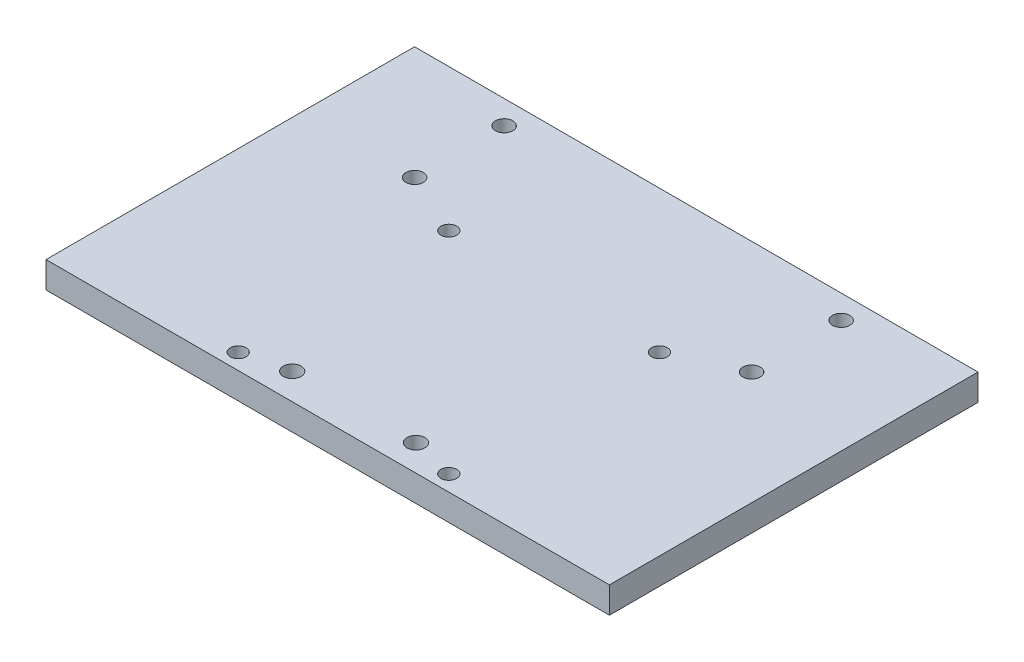
ISO-10303-21;
HEADER;
FILE_DESCRIPTION(('STEP AP214'),'2;1');
FILE_NAME('part.step','',(''),(''),'','','');
FILE_SCHEMA(('AUTOMOTIVE_DESIGN { 1 0 10303 214 1 1 1 1 }'));
ENDSEC;
DATA;
#1=APPLICATION_CONTEXT('core data for automotive mechanical design processes');
#2=APPLICATION_PROTOCOL_DEFINITION('international standard','automotive_design',2000,#1);
#3=PRODUCT_CONTEXT('',#1,'mechanical');
#4=PRODUCT('Part','Part','',(#3));
#5=PRODUCT_RELATED_PRODUCT_CATEGORY('part','',(#4));
#6=PRODUCT_DEFINITION_FORMATION('','',#4);
#7=PRODUCT_DEFINITION_CONTEXT('part definition',#1,'design');
#8=PRODUCT_DEFINITION('design','',#6,#7);
#9=PRODUCT_DEFINITION_SHAPE('','',#8);
#10=(LENGTH_UNIT() NAMED_UNIT(*) SI_UNIT(.MILLI.,.METRE.));
#11=(NAMED_UNIT(*) PLANE_ANGLE_UNIT() SI_UNIT($,.RADIAN.));
#12=(NAMED_UNIT(*) SI_UNIT($,.STERADIAN.) SOLID_ANGLE_UNIT());
#13=UNCERTAINTY_MEASURE_WITH_UNIT(LENGTH_MEASURE(1.E-05),#10,'distance_accuracy_value','');
#14=(GEOMETRIC_REPRESENTATION_CONTEXT(3) GLOBAL_UNCERTAINTY_ASSIGNED_CONTEXT((#13)) GLOBAL_UNIT_ASSIGNED_CONTEXT((#10,
#11,#12)) REPRESENTATION_CONTEXT('',''));
#15=CARTESIAN_POINT('',(0.,0.,0.));
#16=DIRECTION('',(0.,0.,1.));
#17=DIRECTION('',(1.,0.,0.));
#18=AXIS2_PLACEMENT_3D('',#15,#16,#17);
#19=CARTESIAN_POINT('',(0.,5.,0.));
#20=DIRECTION('',(0.,1.,0.));
#21=DIRECTION('',(0.,0.,1.));
#22=AXIS2_PLACEMENT_3D('',#19,#20,#21);
#23=PLANE('',#22);
#24=CARTESIAN_POINT('',(22.8075801749271,5.,46.4890670553936));
#25=DIRECTION('',(0.,1.,0.));
#26=DIRECTION('',(0.,0.,1.));
#27=AXIS2_PLACEMENT_3D('',#24,#25,#26);
#28=CIRCLE('',#27,1.5);
#29=CARTESIAN_POINT('',(22.8075801749271,5.,47.9890670553936));
#30=VERTEX_POINT('',#29);
#31=EDGE_CURVE('E169',#30,#30,#28,.T.);
#32=ORIENTED_EDGE('',*,*,#31,.F.);
#33=EDGE_LOOP('',(#32));
#34=FACE_BOUND('',#33,.T.);
#35=CARTESIAN_POINT('',(34.8075801749271,5.,-16.0109329446064));
#36=DIRECTION('',(0.,1.,0.));
#37=DIRECTION('',(0.,0.,1.));
#38=AXIS2_PLACEMENT_3D('',#35,#36,#37);
#39=CIRCLE('',#38,1.65);
#40=CARTESIAN_POINT('',(34.8075801749271,5.,-14.3609329446064));
#41=VERTEX_POINT('',#40);
#42=EDGE_CURVE('E137',#41,#41,#39,.T.);
#43=ORIENTED_EDGE('',*,*,#42,.F.);
#44=EDGE_LOOP('',(#43));
#45=FACE_BOUND('',#44,.T.);
#46=CARTESIAN_POINT('',(34.8075801749271,5.,0.989067055393582));
#47=DIRECTION('',(0.,-1.,0.));
#48=DIRECTION('',(0.,0.,-1.));
#49=AXIS2_PLACEMENT_3D('',#46,#47,#48);
#50=CIRCLE('',#49,1.65);
#51=CARTESIAN_POINT('',(34.8075801749271,5.,-0.660932944606414));
#52=VERTEX_POINT('',#51);
#53=EDGE_CURVE('E162',#52,#52,#50,.T.);
#54=ORIENTED_EDGE('',*,*,#53,.T.);
#55=EDGE_LOOP('',(#54));
#56=FACE_BOUND('',#55,.T.);
#57=DIRECTION('',(0.,0.,1.));
#58=VECTOR('',#57,1.);
#59=CARTESIAN_POINT('',(-50.6924198250729,5.,-20.5109329446064));
#60=LINE('',#59,#58);
#61=CARTESIAN_POINT('',(-50.6924198250729,5.,-20.5109329446064));
#62=VERTEX_POINT('',#61);
#63=CARTESIAN_POINT('',(-50.6924198250729,5.,49.4890670553936));
#64=VERTEX_POINT('',#63);
#65=EDGE_CURVE('E91',#62,#64,#60,.T.);
#66=ORIENTED_EDGE('',*,*,#65,.T.);
#67=DIRECTION('',(1.,0.,0.));
#68=VECTOR('',#67,1.);
#69=CARTESIAN_POINT('',(-50.6924198250729,5.,49.4890670553936));
#70=LINE('',#69,#68);
#71=CARTESIAN_POINT('',(56.3075801749272,5.,49.4890670553936));
#72=VERTEX_POINT('',#71);
#73=EDGE_CURVE('E86',#64,#72,#70,.T.);
#74=ORIENTED_EDGE('',*,*,#73,.T.);
#75=DIRECTION('',(0.,0.,-1.));
#76=VECTOR('',#75,1.);
#77=CARTESIAN_POINT('',(56.3075801749271,5.,-20.5109329446064));
#78=LINE('',#77,#76);
#79=CARTESIAN_POINT('',(56.3075801749271,5.,-20.5109329446064));
#80=VERTEX_POINT('',#79);
#81=EDGE_CURVE('E89',#72,#80,#78,.T.);
#82=ORIENTED_EDGE('',*,*,#81,.T.);
#83=DIRECTION('',(-1.,0.,0.));
#84=VECTOR('',#83,1.);
#85=CARTESIAN_POINT('',(-50.6924198250729,5.,-20.5109329446064));
#86=LINE('',#85,#84);
#87=EDGE_CURVE('E56',#80,#62,#86,.T.);
#88=ORIENTED_EDGE('',*,*,#87,.T.);
#89=EDGE_LOOP('',(#66,#74,#82,#88));
#90=FACE_BOUND('',#89,.T.);
#91=CARTESIAN_POINT('',(-29.1924198250729,5.,-16.0109329446064));
#92=DIRECTION('',(0.,-1.,0.));
#93=DIRECTION('',(0.,0.,-1.));
#94=AXIS2_PLACEMENT_3D('',#91,#92,#93);
#95=CIRCLE('',#94,1.65);
#96=CARTESIAN_POINT('',(-29.1924198250729,5.,-17.6609329446064));
#97=VERTEX_POINT('',#96);
#98=EDGE_CURVE('E111',#97,#97,#95,.T.);
#99=ORIENTED_EDGE('',*,*,#98,.T.);
#100=EDGE_LOOP('',(#99));
#101=FACE_BOUND('',#100,.T.);
#102=CARTESIAN_POINT('',(22.8075801749271,5.,6.48906705539359));
#103=DIRECTION('',(0.,-1.,0.));
#104=DIRECTION('',(0.,0.,-1.));
#105=AXIS2_PLACEMENT_3D('',#102,#103,#104);
#106=CIRCLE('',#105,1.5);
#107=CARTESIAN_POINT('',(22.8075801749271,5.,4.98906705539359));
#108=VERTEX_POINT('',#107);
#109=EDGE_CURVE('E201',#108,#108,#106,.T.);
#110=ORIENTED_EDGE('',*,*,#109,.T.);
#111=EDGE_LOOP('',(#110));
#112=FACE_BOUND('',#111,.T.);
#113=CARTESIAN_POINT('',(-29.1924198250729,5.,0.989067055393582));
#114=DIRECTION('',(0.,1.,0.));
#115=DIRECTION('',(0.,0.,1.));
#116=AXIS2_PLACEMENT_3D('',#113,#114,#115);
#117=CIRCLE('',#116,1.65);
#118=CARTESIAN_POINT('',(-29.1924198250729,5.,2.63906705539358));
#119=VERTEX_POINT('',#118);
#120=EDGE_CURVE('E153',#119,#119,#117,.T.);
#121=ORIENTED_EDGE('',*,*,#120,.F.);
#122=EDGE_LOOP('',(#121));
#123=FACE_BOUND('',#122,.T.);
#124=CARTESIAN_POINT('',(-8.94241982507289,5.,44.4890670553936));
#125=DIRECTION('',(0.,-1.,0.));
#126=DIRECTION('',(0.,0.,-1.));
#127=AXIS2_PLACEMENT_3D('',#124,#125,#126);
#128=CIRCLE('',#127,1.7);
#129=CARTESIAN_POINT('',(-8.94241982507289,5.,42.7890670553936));
#130=VERTEX_POINT('',#129);
#131=EDGE_CURVE('E146',#130,#130,#128,.T.);
#132=ORIENTED_EDGE('',*,*,#131,.T.);
#133=EDGE_LOOP('',(#132));
#134=FACE_BOUND('',#133,.T.);
#135=CARTESIAN_POINT('',(-17.1924198250729,5.,46.4890670553936));
#136=DIRECTION('',(0.,-1.,0.));
#137=DIRECTION('',(0.,0.,-1.));
#138=AXIS2_PLACEMENT_3D('',#135,#136,#137);
#139=CIRCLE('',#138,1.5);
#140=CARTESIAN_POINT('',(-17.1924198250729,5.,44.9890670553936));
#141=VERTEX_POINT('',#140);
#142=EDGE_CURVE('E185',#141,#141,#139,.T.);
#143=ORIENTED_EDGE('',*,*,#142,.T.);
#144=EDGE_LOOP('',(#143));
#145=FACE_BOUND('',#144,.T.);
#146=CARTESIAN_POINT('',(14.5575801749272,5.,44.4890670553936));
#147=DIRECTION('',(0.,1.,0.));
#148=DIRECTION('',(0.,0.,1.));
#149=AXIS2_PLACEMENT_3D('',#146,#147,#148);
#150=CIRCLE('',#149,1.7);
#151=CARTESIAN_POINT('',(14.5575801749272,5.,46.1890670553936));
#152=VERTEX_POINT('',#151);
#153=EDGE_CURVE('E194',#152,#152,#150,.T.);
#154=ORIENTED_EDGE('',*,*,#153,.F.);
#155=EDGE_LOOP('',(#154));
#156=FACE_BOUND('',#155,.T.);
#157=CARTESIAN_POINT('',(-17.1924198250729,5.,6.48906705539359));
#158=DIRECTION('',(0.,1.,0.));
#159=DIRECTION('',(0.,0.,1.));
#160=AXIS2_PLACEMENT_3D('',#157,#158,#159);
#161=CIRCLE('',#160,1.5);
#162=CARTESIAN_POINT('',(-17.1924198250729,5.,7.98906705539359));
#163=VERTEX_POINT('',#162);
#164=EDGE_CURVE('E178',#163,#163,#161,.T.);
#165=ORIENTED_EDGE('',*,*,#164,.F.);
#166=EDGE_LOOP('',(#165));
#167=FACE_BOUND('',#166,.T.);
#168=ADVANCED_FACE('F38',(#34,#45,#56,#90,#101,#112,#123,#134,#145,#156,#167),#23,.T.);
#169=CARTESIAN_POINT('',(0.,0.,0.));
#170=DIRECTION('',(0.,1.,0.));
#171=DIRECTION('',(0.,0.,1.));
#172=AXIS2_PLACEMENT_3D('',#169,#170,#171);
#173=PLANE('',#172);
#174=CARTESIAN_POINT('',(-17.1924198250729,0.,46.4890670553936));
#175=DIRECTION('',(0.,-1.,0.));
#176=DIRECTION('',(0.,0.,-1.));
#177=AXIS2_PLACEMENT_3D('',#174,#175,#176);
#178=CIRCLE('',#177,1.5);
#179=CARTESIAN_POINT('',(-17.1924198250729,0.,44.9890670553936));
#180=VERTEX_POINT('',#179);
#181=EDGE_CURVE('E189',#180,#180,#178,.T.);
#182=ORIENTED_EDGE('',*,*,#181,.F.);
#183=EDGE_LOOP('',(#182));
#184=FACE_BOUND('',#183,.T.);
#185=CARTESIAN_POINT('',(-8.94241982507289,0.,44.4890670553936));
#186=DIRECTION('',(0.,-1.,0.));
#187=DIRECTION('',(0.,0.,-1.));
#188=AXIS2_PLACEMENT_3D('',#185,#186,#187);
#189=CIRCLE('',#188,1.7);
#190=CARTESIAN_POINT('',(-8.94241982507289,0.,42.7890670553936));
#191=VERTEX_POINT('',#190);
#192=EDGE_CURVE('E133',#191,#191,#189,.T.);
#193=ORIENTED_EDGE('',*,*,#192,.F.);
#194=EDGE_LOOP('',(#193));
#195=FACE_BOUND('',#194,.T.);
#196=CARTESIAN_POINT('',(34.8075801749271,0.,0.989067055393582));
#197=DIRECTION('',(0.,-1.,0.));
#198=DIRECTION('',(0.,0.,-1.));
#199=AXIS2_PLACEMENT_3D('',#196,#197,#198);
#200=CIRCLE('',#199,1.65);
#201=CARTESIAN_POINT('',(34.8075801749271,0.,-0.660932944606414));
#202=VERTEX_POINT('',#201);
#203=EDGE_CURVE('E142',#202,#202,#200,.T.);
#204=ORIENTED_EDGE('',*,*,#203,.F.);
#205=EDGE_LOOP('',(#204));
#206=FACE_BOUND('',#205,.T.);
#207=CARTESIAN_POINT('',(22.8075801749271,0.,6.48906705539359));
#208=DIRECTION('',(0.,-1.,0.));
#209=DIRECTION('',(0.,0.,-1.));
#210=AXIS2_PLACEMENT_3D('',#207,#208,#209);
#211=CIRCLE('',#210,1.5);
#212=CARTESIAN_POINT('',(22.8075801749271,0.,4.98906705539359));
#213=VERTEX_POINT('',#212);
#214=EDGE_CURVE('E190',#213,#213,#211,.T.);
#215=ORIENTED_EDGE('',*,*,#214,.F.);
#216=EDGE_LOOP('',(#215));
#217=FACE_BOUND('',#216,.T.);
#218=CARTESIAN_POINT('',(-29.1924198250729,0.,-16.0109329446064));
#219=DIRECTION('',(0.,-1.,0.));
#220=DIRECTION('',(0.,0.,-1.));
#221=AXIS2_PLACEMENT_3D('',#218,#219,#220);
#222=CIRCLE('',#221,1.65);
#223=CARTESIAN_POINT('',(-29.1924198250729,0.,-17.6609329446064));
#224=VERTEX_POINT('',#223);
#225=EDGE_CURVE('E129',#224,#224,#222,.T.);
#226=ORIENTED_EDGE('',*,*,#225,.F.);
#227=EDGE_LOOP('',(#226));
#228=FACE_BOUND('',#227,.T.);
#229=DIRECTION('',(0.,0.,1.));
#230=VECTOR('',#229,1.);
#231=CARTESIAN_POINT('',(-50.6924198250729,0.,-20.5109329446064));
#232=LINE('',#231,#230);
#233=CARTESIAN_POINT('',(-50.6924198250729,0.,-20.5109329446064));
#234=VERTEX_POINT('',#233);
#235=CARTESIAN_POINT('',(-50.6924198250729,0.,49.4890670553936));
#236=VERTEX_POINT('',#235);
#237=EDGE_CURVE('E107',#234,#236,#232,.T.);
#238=ORIENTED_EDGE('',*,*,#237,.F.);
#239=DIRECTION('',(-1.,0.,0.));
#240=VECTOR('',#239,1.);
#241=CARTESIAN_POINT('',(-50.6924198250729,0.,-20.5109329446064));
#242=LINE('',#241,#240);
#243=CARTESIAN_POINT('',(56.3075801749271,0.,-20.5109329446064));
#244=VERTEX_POINT('',#243);
#245=EDGE_CURVE('E79',#244,#234,#242,.T.);
#246=ORIENTED_EDGE('',*,*,#245,.F.);
#247=DIRECTION('',(0.,0.,-1.));
#248=VECTOR('',#247,1.);
#249=CARTESIAN_POINT('',(56.3075801749271,0.,-20.5109329446064));
#250=LINE('',#249,#248);
#251=CARTESIAN_POINT('',(56.3075801749272,0.,49.4890670553936));
#252=VERTEX_POINT('',#251);
#253=EDGE_CURVE('E73',#252,#244,#250,.T.);
#254=ORIENTED_EDGE('',*,*,#253,.F.);
#255=DIRECTION('',(1.,0.,0.));
#256=VECTOR('',#255,1.);
#257=CARTESIAN_POINT('',(-50.6924198250729,0.,49.4890670553936));
#258=LINE('',#257,#256);
#259=EDGE_CURVE('E96',#236,#252,#258,.T.);
#260=ORIENTED_EDGE('',*,*,#259,.F.);
#261=EDGE_LOOP('',(#238,#246,#254,#260));
#262=FACE_BOUND('',#261,.T.);
#263=CARTESIAN_POINT('',(-29.1924198250729,0.,0.989067055393582));
#264=DIRECTION('',(0.,1.,0.));
#265=DIRECTION('',(0.,0.,1.));
#266=AXIS2_PLACEMENT_3D('',#263,#264,#265);
#267=CIRCLE('',#266,1.65);
#268=CARTESIAN_POINT('',(-29.1924198250729,0.,2.63906705539358));
#269=VERTEX_POINT('',#268);
#270=EDGE_CURVE('E157',#269,#269,#267,.T.);
#271=ORIENTED_EDGE('',*,*,#270,.T.);
#272=EDGE_LOOP('',(#271));
#273=FACE_BOUND('',#272,.T.);
#274=CARTESIAN_POINT('',(34.8075801749271,0.,-16.0109329446064));
#275=DIRECTION('',(0.,1.,0.));
#276=DIRECTION('',(0.,0.,1.));
#277=AXIS2_PLACEMENT_3D('',#274,#275,#276);
#278=CIRCLE('',#277,1.65);
#279=CARTESIAN_POINT('',(34.8075801749271,0.,-14.3609329446064));
#280=VERTEX_POINT('',#279);
#281=EDGE_CURVE('E141',#280,#280,#278,.T.);
#282=ORIENTED_EDGE('',*,*,#281,.T.);
#283=EDGE_LOOP('',(#282));
#284=FACE_BOUND('',#283,.T.);
#285=CARTESIAN_POINT('',(14.5575801749272,0.,44.4890670553936));
#286=DIRECTION('',(0.,1.,0.));
#287=DIRECTION('',(0.,0.,1.));
#288=AXIS2_PLACEMENT_3D('',#285,#286,#287);
#289=CIRCLE('',#288,1.7);
#290=CARTESIAN_POINT('',(14.5575801749272,0.,46.1890670553936));
#291=VERTEX_POINT('',#290);
#292=EDGE_CURVE('E174',#291,#291,#289,.T.);
#293=ORIENTED_EDGE('',*,*,#292,.T.);
#294=EDGE_LOOP('',(#293));
#295=FACE_BOUND('',#294,.T.);
#296=CARTESIAN_POINT('',(22.8075801749271,0.,46.4890670553936));
#297=DIRECTION('',(0.,1.,0.));
#298=DIRECTION('',(0.,0.,1.));
#299=AXIS2_PLACEMENT_3D('',#296,#297,#298);
#300=CIRCLE('',#299,1.5);
#301=CARTESIAN_POINT('',(22.8075801749271,0.,47.9890670553936));
#302=VERTEX_POINT('',#301);
#303=EDGE_CURVE('E173',#302,#302,#300,.T.);
#304=ORIENTED_EDGE('',*,*,#303,.T.);
#305=EDGE_LOOP('',(#304));
#306=FACE_BOUND('',#305,.T.);
#307=CARTESIAN_POINT('',(-17.1924198250729,0.,6.48906705539359));
#308=DIRECTION('',(0.,1.,0.));
#309=DIRECTION('',(0.,0.,1.));
#310=AXIS2_PLACEMENT_3D('',#307,#308,#309);
#311=CIRCLE('',#310,1.5);
#312=CARTESIAN_POINT('',(-17.1924198250729,0.,7.98906705539359));
#313=VERTEX_POINT('',#312);
#314=EDGE_CURVE('E158',#313,#313,#311,.T.);
#315=ORIENTED_EDGE('',*,*,#314,.T.);
#316=EDGE_LOOP('',(#315));
#317=FACE_BOUND('',#316,.T.);
#318=ADVANCED_FACE('F124',(#184,#195,#206,#217,#228,#262,#273,#284,#295,#306,#317),#173,.F.);
#319=CARTESIAN_POINT('',(-50.6924198250729,5.,-20.5109329446064));
#320=DIRECTION('',(1.,0.,0.));
#321=DIRECTION('',(0.,0.,-1.));
#322=AXIS2_PLACEMENT_3D('',#319,#320,#321);
#323=PLANE('',#322);
#324=ORIENTED_EDGE('',*,*,#237,.T.);
#325=DIRECTION('',(0.,-1.,0.));
#326=VECTOR('',#325,1.);
#327=CARTESIAN_POINT('',(-50.6924198250729,5.,49.4890670553936));
#328=LINE('',#327,#326);
#329=EDGE_CURVE('E11',#64,#236,#328,.T.);
#330=ORIENTED_EDGE('',*,*,#329,.F.);
#331=ORIENTED_EDGE('',*,*,#65,.F.);
#332=DIRECTION('',(0.,-1.,0.));
#333=VECTOR('',#332,1.);
#334=CARTESIAN_POINT('',(-50.6924198250729,5.,-20.5109329446064));
#335=LINE('',#334,#333);
#336=EDGE_CURVE('E103',#62,#234,#335,.T.);
#337=ORIENTED_EDGE('',*,*,#336,.T.);
#338=EDGE_LOOP('',(#324,#330,#331,#337));
#339=FACE_BOUND('',#338,.T.);
#340=ADVANCED_FACE('F40',(#339),#323,.F.);
#341=CARTESIAN_POINT('',(-50.6924198250729,5.,49.4890670553936));
#342=DIRECTION('',(0.,0.,-1.));
#343=DIRECTION('',(-1.,0.,0.));
#344=AXIS2_PLACEMENT_3D('',#341,#342,#343);
#345=PLANE('',#344);
#346=ORIENTED_EDGE('',*,*,#259,.T.);
#347=DIRECTION('',(0.,-1.,0.));
#348=VECTOR('',#347,1.);
#349=CARTESIAN_POINT('',(56.3075801749272,5.,49.4890670553936));
#350=LINE('',#349,#348);
#351=EDGE_CURVE('E48',#72,#252,#350,.T.);
#352=ORIENTED_EDGE('',*,*,#351,.F.);
#353=ORIENTED_EDGE('',*,*,#73,.F.);
#354=ORIENTED_EDGE('',*,*,#329,.T.);
#355=EDGE_LOOP('',(#346,#352,#353,#354));
#356=FACE_BOUND('',#355,.T.);
#357=ADVANCED_FACE('F95',(#356),#345,.F.);
#358=CARTESIAN_POINT('',(56.3075801749271,5.,-20.5109329446064));
#359=DIRECTION('',(-1.,0.,0.));
#360=DIRECTION('',(0.,0.,1.));
#361=AXIS2_PLACEMENT_3D('',#358,#359,#360);
#362=PLANE('',#361);
#363=ORIENTED_EDGE('',*,*,#253,.T.);
#364=DIRECTION('',(0.,-1.,0.));
#365=VECTOR('',#364,1.);
#366=CARTESIAN_POINT('',(56.3075801749271,5.,-20.5109329446064));
#367=LINE('',#366,#365);
#368=EDGE_CURVE('E98',#80,#244,#367,.T.);
#369=ORIENTED_EDGE('',*,*,#368,.F.);
#370=ORIENTED_EDGE('',*,*,#81,.F.);
#371=ORIENTED_EDGE('',*,*,#351,.T.);
#372=EDGE_LOOP('',(#363,#369,#370,#371));
#373=FACE_BOUND('',#372,.T.);
#374=ADVANCED_FACE('F99',(#373),#362,.F.);
#375=CARTESIAN_POINT('',(-50.6924198250729,5.,-20.5109329446064));
#376=DIRECTION('',(0.,0.,1.));
#377=DIRECTION('',(1.,0.,0.));
#378=AXIS2_PLACEMENT_3D('',#375,#376,#377);
#379=PLANE('',#378);
#380=ORIENTED_EDGE('',*,*,#245,.T.);
#381=ORIENTED_EDGE('',*,*,#336,.F.);
#382=ORIENTED_EDGE('',*,*,#87,.F.);
#383=ORIENTED_EDGE('',*,*,#368,.T.);
#384=EDGE_LOOP('',(#380,#381,#382,#383));
#385=FACE_BOUND('',#384,.T.);
#386=ADVANCED_FACE('F121',(#385),#379,.F.);
#387=CARTESIAN_POINT('',(-29.1924198250729,5.,-16.0109329446064));
#388=DIRECTION('',(0.,-1.,0.));
#389=DIRECTION('',(0.,0.,-1.));
#390=AXIS2_PLACEMENT_3D('',#387,#388,#389);
#391=CYLINDRICAL_SURFACE('',#390,1.65);
#392=ORIENTED_EDGE('',*,*,#98,.F.);
#393=EDGE_LOOP('',(#392));
#394=FACE_BOUND('',#393,.T.);
#395=ORIENTED_EDGE('',*,*,#225,.T.);
#396=EDGE_LOOP('',(#395));
#397=FACE_BOUND('',#396,.T.);
#398=ADVANCED_FACE('F217',(#394,#397),#391,.F.);
#399=CARTESIAN_POINT('',(22.8075801749271,5.,6.48906705539359));
#400=DIRECTION('',(0.,-1.,0.));
#401=DIRECTION('',(0.,0.,-1.));
#402=AXIS2_PLACEMENT_3D('',#399,#400,#401);
#403=CYLINDRICAL_SURFACE('',#402,1.5);
#404=ORIENTED_EDGE('',*,*,#109,.F.);
#405=EDGE_LOOP('',(#404));
#406=FACE_BOUND('',#405,.T.);
#407=ORIENTED_EDGE('',*,*,#214,.T.);
#408=EDGE_LOOP('',(#407));
#409=FACE_BOUND('',#408,.T.);
#410=ADVANCED_FACE('F209',(#406,#409),#403,.F.);
#411=CARTESIAN_POINT('',(-29.1924198250729,5.,0.989067055393582));
#412=DIRECTION('',(0.,-1.,0.));
#413=DIRECTION('',(0.,0.,-1.));
#414=AXIS2_PLACEMENT_3D('',#411,#412,#413);
#415=CYLINDRICAL_SURFACE('',#414,1.65);
#416=ORIENTED_EDGE('',*,*,#120,.T.);
#417=EDGE_LOOP('',(#416));
#418=FACE_BOUND('',#417,.T.);
#419=ORIENTED_EDGE('',*,*,#270,.F.);
#420=EDGE_LOOP('',(#419));
#421=FACE_BOUND('',#420,.T.);
#422=ADVANCED_FACE('F225',(#418,#421),#415,.F.);
#423=CARTESIAN_POINT('',(34.8075801749271,5.,0.989067055393582));
#424=DIRECTION('',(0.,-1.,0.));
#425=DIRECTION('',(0.,0.,-1.));
#426=AXIS2_PLACEMENT_3D('',#423,#424,#425);
#427=CYLINDRICAL_SURFACE('',#426,1.65);
#428=ORIENTED_EDGE('',*,*,#53,.F.);
#429=EDGE_LOOP('',(#428));
#430=FACE_BOUND('',#429,.T.);
#431=ORIENTED_EDGE('',*,*,#203,.T.);
#432=EDGE_LOOP('',(#431));
#433=FACE_BOUND('',#432,.T.);
#434=ADVANCED_FACE('F273',(#430,#433),#427,.F.);
#435=CARTESIAN_POINT('',(34.8075801749271,5.,-16.0109329446064));
#436=DIRECTION('',(0.,-1.,0.));
#437=DIRECTION('',(0.,0.,-1.));
#438=AXIS2_PLACEMENT_3D('',#435,#436,#437);
#439=CYLINDRICAL_SURFACE('',#438,1.65);
#440=ORIENTED_EDGE('',*,*,#42,.T.);
#441=EDGE_LOOP('',(#440));
#442=FACE_BOUND('',#441,.T.);
#443=ORIENTED_EDGE('',*,*,#281,.F.);
#444=EDGE_LOOP('',(#443));
#445=FACE_BOUND('',#444,.T.);
#446=ADVANCED_FACE('F283',(#442,#445),#439,.F.);
#447=CARTESIAN_POINT('',(-8.94241982507289,5.,44.4890670553936));
#448=DIRECTION('',(0.,-1.,0.));
#449=DIRECTION('',(0.,0.,-1.));
#450=AXIS2_PLACEMENT_3D('',#447,#448,#449);
#451=CYLINDRICAL_SURFACE('',#450,1.7);
#452=ORIENTED_EDGE('',*,*,#131,.F.);
#453=EDGE_LOOP('',(#452));
#454=FACE_BOUND('',#453,.T.);
#455=ORIENTED_EDGE('',*,*,#192,.T.);
#456=EDGE_LOOP('',(#455));
#457=FACE_BOUND('',#456,.T.);
#458=ADVANCED_FACE('F293',(#454,#457),#451,.F.);
#459=CARTESIAN_POINT('',(-17.1924198250729,5.,46.4890670553936));
#460=DIRECTION('',(0.,-1.,0.));
#461=DIRECTION('',(0.,0.,-1.));
#462=AXIS2_PLACEMENT_3D('',#459,#460,#461);
#463=CYLINDRICAL_SURFACE('',#462,1.5);
#464=ORIENTED_EDGE('',*,*,#142,.F.);
#465=EDGE_LOOP('',(#464));
#466=FACE_BOUND('',#465,.T.);
#467=ORIENTED_EDGE('',*,*,#181,.T.);
#468=EDGE_LOOP('',(#467));
#469=FACE_BOUND('',#468,.T.);
#470=ADVANCED_FACE('F302',(#466,#469),#463,.F.);
#471=CARTESIAN_POINT('',(14.5575801749272,5.,44.4890670553936));
#472=DIRECTION('',(0.,-1.,0.));
#473=DIRECTION('',(0.,0.,-1.));
#474=AXIS2_PLACEMENT_3D('',#471,#472,#473);
#475=CYLINDRICAL_SURFACE('',#474,1.7);
#476=ORIENTED_EDGE('',*,*,#153,.T.);
#477=EDGE_LOOP('',(#476));
#478=FACE_BOUND('',#477,.T.);
#479=ORIENTED_EDGE('',*,*,#292,.F.);
#480=EDGE_LOOP('',(#479));
#481=FACE_BOUND('',#480,.T.);
#482=ADVANCED_FACE('F312',(#478,#481),#475,.F.);
#483=CARTESIAN_POINT('',(22.8075801749271,5.,46.4890670553936));
#484=DIRECTION('',(0.,-1.,0.));
#485=DIRECTION('',(0.,0.,-1.));
#486=AXIS2_PLACEMENT_3D('',#483,#484,#485);
#487=CYLINDRICAL_SURFACE('',#486,1.5);
#488=ORIENTED_EDGE('',*,*,#31,.T.);
#489=EDGE_LOOP('',(#488));
#490=FACE_BOUND('',#489,.T.);
#491=ORIENTED_EDGE('',*,*,#303,.F.);
#492=EDGE_LOOP('',(#491));
#493=FACE_BOUND('',#492,.T.);
#494=ADVANCED_FACE('F322',(#490,#493),#487,.F.);
#495=CARTESIAN_POINT('',(-17.1924198250729,5.,6.48906705539359));
#496=DIRECTION('',(0.,-1.,0.));
#497=DIRECTION('',(0.,0.,-1.));
#498=AXIS2_PLACEMENT_3D('',#495,#496,#497);
#499=CYLINDRICAL_SURFACE('',#498,1.5);
#500=ORIENTED_EDGE('',*,*,#164,.T.);
#501=EDGE_LOOP('',(#500));
#502=FACE_BOUND('',#501,.T.);
#503=ORIENTED_EDGE('',*,*,#314,.F.);
#504=EDGE_LOOP('',(#503));
#505=FACE_BOUND('',#504,.T.);
#506=ADVANCED_FACE('F332',(#502,#505),#499,.F.);
#507=CLOSED_SHELL('',(#168,#318,#340,#357,#374,#386,#398,#410,#422,#434,#446,#458,#470,#482,
#494,#506));
#508=MANIFOLD_SOLID_BREP('B2',#507);
#509=ADVANCED_BREP_SHAPE_REPRESENTATION('',(#18,#508),#14);
#510=SHAPE_DEFINITION_REPRESENTATION(#9,#509);
ENDSEC;
END-ISO-10303-21;
